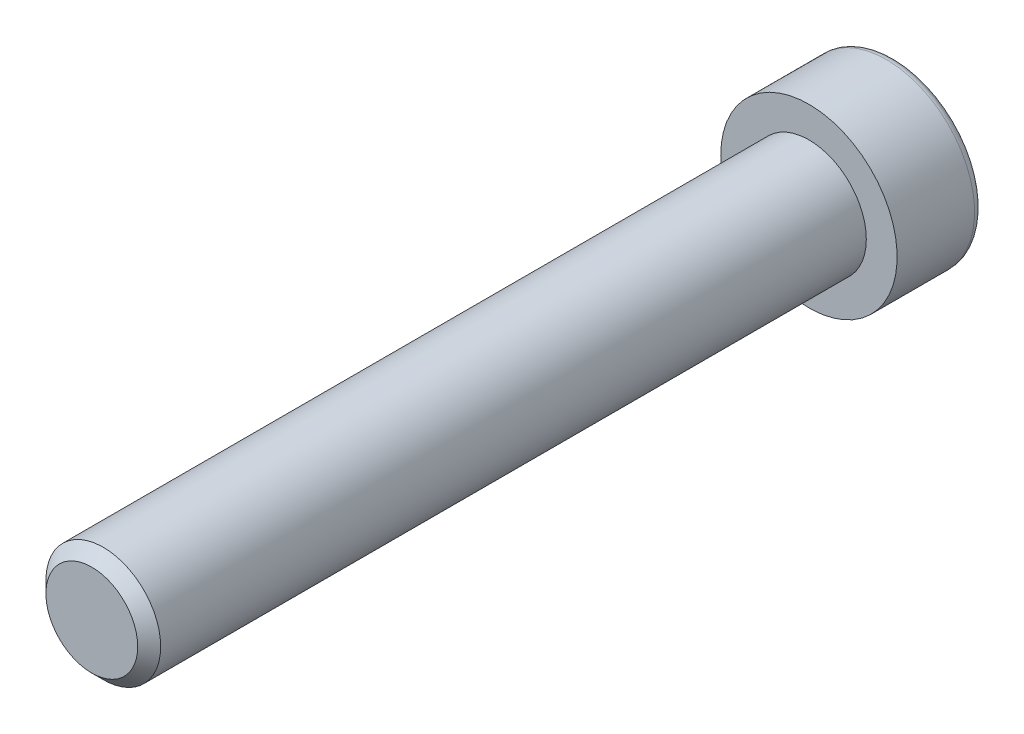
ISO-10303-21;
HEADER;
FILE_DESCRIPTION(('STEP AP214'),'2;1');
FILE_NAME('part.step','',(''),(''),'','','');
FILE_SCHEMA(('AUTOMOTIVE_DESIGN { 1 0 10303 214 1 1 1 1 }'));
ENDSEC;
DATA;
#1=APPLICATION_CONTEXT('core data for automotive mechanical design processes');
#2=APPLICATION_PROTOCOL_DEFINITION('international standard','automotive_design',2000,#1);
#3=PRODUCT_CONTEXT('',#1,'mechanical');
#4=PRODUCT('Part','Part','',(#3));
#5=PRODUCT_RELATED_PRODUCT_CATEGORY('part','',(#4));
#6=PRODUCT_DEFINITION_FORMATION('','',#4);
#7=PRODUCT_DEFINITION_CONTEXT('part definition',#1,'design');
#8=PRODUCT_DEFINITION('design','',#6,#7);
#9=PRODUCT_DEFINITION_SHAPE('','',#8);
#10=(LENGTH_UNIT() NAMED_UNIT(*) SI_UNIT(.MILLI.,.METRE.));
#11=(NAMED_UNIT(*) PLANE_ANGLE_UNIT() SI_UNIT($,.RADIAN.));
#12=(NAMED_UNIT(*) SI_UNIT($,.STERADIAN.) SOLID_ANGLE_UNIT());
#13=UNCERTAINTY_MEASURE_WITH_UNIT(LENGTH_MEASURE(1.E-05),#10,'distance_accuracy_value','');
#14=(GEOMETRIC_REPRESENTATION_CONTEXT(3) GLOBAL_UNCERTAINTY_ASSIGNED_CONTEXT((#13)) GLOBAL_UNIT_ASSIGNED_CONTEXT((#10,
#11,#12)) REPRESENTATION_CONTEXT('',''));
#15=CARTESIAN_POINT('',(0.,0.,0.));
#16=DIRECTION('',(0.,0.,1.));
#17=DIRECTION('',(1.,0.,0.));
#18=AXIS2_PLACEMENT_3D('',#15,#16,#17);
#19=CARTESIAN_POINT('',(0.,0.,-6.));
#20=DIRECTION('',(0.,0.,1.));
#21=DIRECTION('',(1.,0.,0.));
#22=AXIS2_PLACEMENT_3D('',#19,#20,#21);
#23=PLANE('',#22);
#24=CARTESIAN_POINT('',(0.,0.,-6.));
#25=DIRECTION('',(0.,0.,-1.));
#26=DIRECTION('',(-1.,0.,0.));
#27=AXIS2_PLACEMENT_3D('',#24,#25,#26);
#28=CIRCLE('',#27,5.55);
#29=CARTESIAN_POINT('',(-5.55,0.,-6.));
#30=VERTEX_POINT('',#29);
#31=EDGE_CURVE('E148',#30,#30,#28,.T.);
#32=ORIENTED_EDGE('',*,*,#31,.T.);
#33=EDGE_LOOP('',(#32));
#34=FACE_BOUND('',#33,.T.);
#35=DIRECTION('',(-0.86602540378444,0.499999999999998,0.));
#36=VECTOR('',#35,1.);
#37=CARTESIAN_POINT('',(0.,3.46410161513776,-6.));
#38=LINE('',#37,#36);
#39=CARTESIAN_POINT('',(3.,1.73205080756888,-6.));
#40=VERTEX_POINT('',#39);
#41=CARTESIAN_POINT('',(0.,3.46410161513776,-6.));
#42=VERTEX_POINT('',#41);
#43=EDGE_CURVE('E50',#40,#42,#38,.T.);
#44=ORIENTED_EDGE('',*,*,#43,.T.);
#45=DIRECTION('',(-0.866025403784438,-0.500000000000002,0.));
#46=VECTOR('',#45,1.);
#47=CARTESIAN_POINT('',(0.,3.46410161513776,-6.));
#48=LINE('',#47,#46);
#49=CARTESIAN_POINT('',(-3.,1.73205080756888,-6.));
#50=VERTEX_POINT('',#49);
#51=EDGE_CURVE('E121',#42,#50,#48,.T.);
#52=ORIENTED_EDGE('',*,*,#51,.T.);
#53=DIRECTION('',(0.,-1.,0.));
#54=VECTOR('',#53,1.);
#55=CARTESIAN_POINT('',(-3.,-1.73205080756888,-6.));
#56=LINE('',#55,#54);
#57=CARTESIAN_POINT('',(-3.,-1.73205080756888,-6.));
#58=VERTEX_POINT('',#57);
#59=EDGE_CURVE('E125',#50,#58,#56,.T.);
#60=ORIENTED_EDGE('',*,*,#59,.T.);
#61=DIRECTION('',(0.866025403784438,-0.500000000000002,0.));
#62=VECTOR('',#61,1.);
#63=CARTESIAN_POINT('',(0.,-3.46410161513776,-6.));
#64=LINE('',#63,#62);
#65=CARTESIAN_POINT('',(0.,-3.46410161513776,-6.));
#66=VERTEX_POINT('',#65);
#67=EDGE_CURVE('E128',#58,#66,#64,.T.);
#68=ORIENTED_EDGE('',*,*,#67,.T.);
#69=DIRECTION('',(0.86602540378444,0.499999999999998,0.));
#70=VECTOR('',#69,1.);
#71=CARTESIAN_POINT('',(0.,-3.46410161513776,-6.));
#72=LINE('',#71,#70);
#73=CARTESIAN_POINT('',(3.,-1.73205080756888,-6.));
#74=VERTEX_POINT('',#73);
#75=EDGE_CURVE('E111',#66,#74,#72,.T.);
#76=ORIENTED_EDGE('',*,*,#75,.T.);
#77=DIRECTION('',(0.,1.,0.));
#78=VECTOR('',#77,1.);
#79=CARTESIAN_POINT('',(3.,-1.73205080756888,-6.));
#80=LINE('',#79,#78);
#81=EDGE_CURVE('E131',#74,#40,#80,.T.);
#82=ORIENTED_EDGE('',*,*,#81,.T.);
#83=EDGE_LOOP('',(#44,#52,#60,#68,#76,#82));
#84=FACE_BOUND('',#83,.T.);
#85=ADVANCED_FACE('F35',(#34,#84),#23,.F.);
#86=CARTESIAN_POINT('',(0.,0.,-5.4));
#87=DIRECTION('',(0.,0.,-1.));
#88=DIRECTION('',(-1.,0.,0.));
#89=AXIS2_PLACEMENT_3D('',#86,#87,#88);
#90=TOROIDAL_SURFACE('',#89,5.55,0.6);
#91=ORIENTED_EDGE('',*,*,#31,.F.);
#92=EDGE_LOOP('',(#91));
#93=FACE_BOUND('',#92,.T.);
#94=CARTESIAN_POINT('',(0.,0.,-5.4));
#95=DIRECTION('',(0.,0.,-1.));
#96=DIRECTION('',(-1.,0.,0.));
#97=AXIS2_PLACEMENT_3D('',#94,#95,#96);
#98=CIRCLE('',#97,6.15);
#99=CARTESIAN_POINT('',(-6.15,0.,-5.4));
#100=VERTEX_POINT('',#99);
#101=EDGE_CURVE('E145',#100,#100,#98,.T.);
#102=ORIENTED_EDGE('',*,*,#101,.T.);
#103=EDGE_LOOP('',(#102));
#104=FACE_BOUND('',#103,.T.);
#105=ADVANCED_FACE('F165',(#93,#104),#90,.T.);
#106=CARTESIAN_POINT('',(0.,0.,0.));
#107=DIRECTION('',(0.,0.,-1.));
#108=DIRECTION('',(-1.,0.,0.));
#109=AXIS2_PLACEMENT_3D('',#106,#107,#108);
#110=CYLINDRICAL_SURFACE('',#109,6.15);
#111=ORIENTED_EDGE('',*,*,#101,.F.);
#112=EDGE_LOOP('',(#111));
#113=FACE_BOUND('',#112,.T.);
#114=CARTESIAN_POINT('',(0.,0.,0.));
#115=DIRECTION('',(0.,0.,-1.));
#116=DIRECTION('',(-1.,0.,0.));
#117=AXIS2_PLACEMENT_3D('',#114,#115,#116);
#118=CIRCLE('',#117,6.15);
#119=CARTESIAN_POINT('',(-6.15,0.,0.));
#120=VERTEX_POINT('',#119);
#121=EDGE_CURVE('E142',#120,#120,#118,.T.);
#122=ORIENTED_EDGE('',*,*,#121,.T.);
#123=EDGE_LOOP('',(#122));
#124=FACE_BOUND('',#123,.T.);
#125=ADVANCED_FACE('F170',(#113,#124),#110,.T.);
#126=CARTESIAN_POINT('',(0.,0.,0.));
#127=DIRECTION('',(0.,0.,-1.));
#128=DIRECTION('',(-1.,0.,0.));
#129=AXIS2_PLACEMENT_3D('',#126,#127,#128);
#130=PLANE('',#129);
#131=CARTESIAN_POINT('',(0.,0.,0.));
#132=DIRECTION('',(0.,0.,1.));
#133=DIRECTION('',(1.,0.,0.));
#134=AXIS2_PLACEMENT_3D('',#131,#132,#133);
#135=CIRCLE('',#134,4.);
#136=CARTESIAN_POINT('',(4.,0.,0.));
#137=VERTEX_POINT('',#136);
#138=EDGE_CURVE('E122',#137,#137,#135,.T.);
#139=ORIENTED_EDGE('',*,*,#138,.F.);
#140=EDGE_LOOP('',(#139));
#141=FACE_BOUND('',#140,.T.);
#142=ORIENTED_EDGE('',*,*,#121,.F.);
#143=EDGE_LOOP('',(#142));
#144=FACE_BOUND('',#143,.T.);
#145=ADVANCED_FACE('F177',(#141,#144),#130,.F.);
#146=CARTESIAN_POINT('',(0.,3.46410161513776,-3.));
#147=DIRECTION('',(-0.499999999999998,-0.86602540378444,0.));
#148=DIRECTION('',(0.86602540378444,-0.499999999999998,0.));
#149=AXIS2_PLACEMENT_3D('',#146,#147,#148);
#150=PLANE('',#149);
#151=ORIENTED_EDGE('',*,*,#43,.F.);
#152=DIRECTION('',(0.,0.,-1.));
#153=VECTOR('',#152,1.);
#154=CARTESIAN_POINT('',(3.,1.73205080756888,-3.));
#155=LINE('',#154,#153);
#156=CARTESIAN_POINT('',(3.,1.73205080756888,-3.));
#157=VERTEX_POINT('',#156);
#158=EDGE_CURVE('E116',#157,#40,#155,.T.);
#159=ORIENTED_EDGE('',*,*,#158,.F.);
#160=DIRECTION('',(-0.86602540378444,0.499999999999998,0.));
#161=VECTOR('',#160,1.);
#162=CARTESIAN_POINT('',(0.,3.46410161513776,-3.));
#163=LINE('',#162,#161);
#164=CARTESIAN_POINT('',(0.,3.46410161513776,-3.));
#165=VERTEX_POINT('',#164);
#166=EDGE_CURVE('E134',#157,#165,#163,.T.);
#167=ORIENTED_EDGE('',*,*,#166,.T.);
#168=DIRECTION('',(0.,0.,-1.));
#169=VECTOR('',#168,1.);
#170=CARTESIAN_POINT('',(0.,3.46410161513776,-3.));
#171=LINE('',#170,#169);
#172=EDGE_CURVE('E140',#165,#42,#171,.T.);
#173=ORIENTED_EDGE('',*,*,#172,.T.);
#174=EDGE_LOOP('',(#151,#159,#167,#173));
#175=FACE_BOUND('',#174,.T.);
#176=ADVANCED_FACE('F181',(#175),#150,.T.);
#177=CARTESIAN_POINT('',(0.,3.46410161513776,-3.));
#178=DIRECTION('',(0.500000000000002,-0.866025403784438,0.));
#179=DIRECTION('',(0.866025403784438,0.500000000000002,0.));
#180=AXIS2_PLACEMENT_3D('',#177,#178,#179);
#181=PLANE('',#180);
#182=ORIENTED_EDGE('',*,*,#51,.F.);
#183=ORIENTED_EDGE('',*,*,#172,.F.);
#184=DIRECTION('',(-0.866025403784438,-0.500000000000002,0.));
#185=VECTOR('',#184,1.);
#186=CARTESIAN_POINT('',(0.,3.46410161513776,-3.));
#187=LINE('',#186,#185);
#188=CARTESIAN_POINT('',(-3.,1.73205080756888,-3.));
#189=VERTEX_POINT('',#188);
#190=EDGE_CURVE('E89',#165,#189,#187,.T.);
#191=ORIENTED_EDGE('',*,*,#190,.T.);
#192=DIRECTION('',(0.,0.,-1.));
#193=VECTOR('',#192,1.);
#194=CARTESIAN_POINT('',(-3.,1.73205080756888,-3.));
#195=LINE('',#194,#193);
#196=EDGE_CURVE('E138',#189,#50,#195,.T.);
#197=ORIENTED_EDGE('',*,*,#196,.T.);
#198=EDGE_LOOP('',(#182,#183,#191,#197));
#199=FACE_BOUND('',#198,.T.);
#200=ADVANCED_FACE('F185',(#199),#181,.T.);
#201=CARTESIAN_POINT('',(-3.,-1.73205080756888,-3.));
#202=DIRECTION('',(1.,0.,0.));
#203=DIRECTION('',(0.,0.,-1.));
#204=AXIS2_PLACEMENT_3D('',#201,#202,#203);
#205=PLANE('',#204);
#206=ORIENTED_EDGE('',*,*,#59,.F.);
#207=ORIENTED_EDGE('',*,*,#196,.F.);
#208=DIRECTION('',(0.,-1.,0.));
#209=VECTOR('',#208,1.);
#210=CARTESIAN_POINT('',(-3.,-1.73205080756888,-3.));
#211=LINE('',#210,#209);
#212=CARTESIAN_POINT('',(-3.,-1.73205080756888,-3.));
#213=VERTEX_POINT('',#212);
#214=EDGE_CURVE('E107',#189,#213,#211,.T.);
#215=ORIENTED_EDGE('',*,*,#214,.T.);
#216=DIRECTION('',(0.,0.,-1.));
#217=VECTOR('',#216,1.);
#218=CARTESIAN_POINT('',(-3.,-1.73205080756888,-3.));
#219=LINE('',#218,#217);
#220=EDGE_CURVE('E104',#213,#58,#219,.T.);
#221=ORIENTED_EDGE('',*,*,#220,.T.);
#222=EDGE_LOOP('',(#206,#207,#215,#221));
#223=FACE_BOUND('',#222,.T.);
#224=ADVANCED_FACE('F188',(#223),#205,.T.);
#225=CARTESIAN_POINT('',(0.,-3.46410161513776,-3.));
#226=DIRECTION('',(0.500000000000002,0.866025403784438,0.));
#227=DIRECTION('',(-0.866025403784438,0.500000000000002,0.));
#228=AXIS2_PLACEMENT_3D('',#225,#226,#227);
#229=PLANE('',#228);
#230=ORIENTED_EDGE('',*,*,#67,.F.);
#231=ORIENTED_EDGE('',*,*,#220,.F.);
#232=DIRECTION('',(0.866025403784438,-0.500000000000002,0.));
#233=VECTOR('',#232,1.);
#234=CARTESIAN_POINT('',(0.,-3.46410161513776,-3.));
#235=LINE('',#234,#233);
#236=CARTESIAN_POINT('',(0.,-3.46410161513776,-3.));
#237=VERTEX_POINT('',#236);
#238=EDGE_CURVE('E99',#213,#237,#235,.T.);
#239=ORIENTED_EDGE('',*,*,#238,.T.);
#240=DIRECTION('',(0.,0.,-1.));
#241=VECTOR('',#240,1.);
#242=CARTESIAN_POINT('',(0.,-3.46410161513776,-3.));
#243=LINE('',#242,#241);
#244=EDGE_CURVE('E103',#237,#66,#243,.T.);
#245=ORIENTED_EDGE('',*,*,#244,.T.);
#246=EDGE_LOOP('',(#230,#231,#239,#245));
#247=FACE_BOUND('',#246,.T.);
#248=ADVANCED_FACE('F102',(#247),#229,.T.);
#249=CARTESIAN_POINT('',(0.,-3.46410161513776,-3.));
#250=DIRECTION('',(-0.499999999999998,0.86602540378444,0.));
#251=DIRECTION('',(-0.86602540378444,-0.499999999999998,0.));
#252=AXIS2_PLACEMENT_3D('',#249,#250,#251);
#253=PLANE('',#252);
#254=ORIENTED_EDGE('',*,*,#75,.F.);
#255=ORIENTED_EDGE('',*,*,#244,.F.);
#256=DIRECTION('',(0.86602540378444,0.499999999999998,0.));
#257=VECTOR('',#256,1.);
#258=CARTESIAN_POINT('',(0.,-3.46410161513776,-3.));
#259=LINE('',#258,#257);
#260=CARTESIAN_POINT('',(3.,-1.73205080756888,-3.));
#261=VERTEX_POINT('',#260);
#262=EDGE_CURVE('E106',#237,#261,#259,.T.);
#263=ORIENTED_EDGE('',*,*,#262,.T.);
#264=DIRECTION('',(0.,0.,-1.));
#265=VECTOR('',#264,1.);
#266=CARTESIAN_POINT('',(3.,-1.73205080756888,-3.));
#267=LINE('',#266,#265);
#268=EDGE_CURVE('E80',#261,#74,#267,.T.);
#269=ORIENTED_EDGE('',*,*,#268,.T.);
#270=EDGE_LOOP('',(#254,#255,#263,#269));
#271=FACE_BOUND('',#270,.T.);
#272=ADVANCED_FACE('F109',(#271),#253,.T.);
#273=CARTESIAN_POINT('',(3.,-1.73205080756888,-3.));
#274=DIRECTION('',(-1.,0.,0.));
#275=DIRECTION('',(0.,-1.,0.));
#276=AXIS2_PLACEMENT_3D('',#273,#274,#275);
#277=PLANE('',#276);
#278=ORIENTED_EDGE('',*,*,#81,.F.);
#279=ORIENTED_EDGE('',*,*,#268,.F.);
#280=DIRECTION('',(0.,1.,0.));
#281=VECTOR('',#280,1.);
#282=CARTESIAN_POINT('',(3.,-1.73205080756888,-3.));
#283=LINE('',#282,#281);
#284=EDGE_CURVE('E58',#261,#157,#283,.T.);
#285=ORIENTED_EDGE('',*,*,#284,.T.);
#286=ORIENTED_EDGE('',*,*,#158,.T.);
#287=EDGE_LOOP('',(#278,#279,#285,#286));
#288=FACE_BOUND('',#287,.T.);
#289=ADVANCED_FACE('F197',(#288),#277,.T.);
#290=CARTESIAN_POINT('',(3.,1.73205080756888,-3.));
#291=DIRECTION('',(0.,0.,1.));
#292=DIRECTION('',(1.,0.,0.));
#293=AXIS2_PLACEMENT_3D('',#290,#291,#292);
#294=PLANE('',#293);
#295=ORIENTED_EDGE('',*,*,#166,.F.);
#296=ORIENTED_EDGE('',*,*,#284,.F.);
#297=ORIENTED_EDGE('',*,*,#262,.F.);
#298=ORIENTED_EDGE('',*,*,#238,.F.);
#299=ORIENTED_EDGE('',*,*,#214,.F.);
#300=ORIENTED_EDGE('',*,*,#190,.F.);
#301=EDGE_LOOP('',(#295,#296,#297,#298,#299,#300));
#302=FACE_BOUND('',#301,.T.);
#303=ADVANCED_FACE('F114',(#302),#294,.F.);
#304=CARTESIAN_POINT('',(0.,0.,50.));
#305=DIRECTION('',(0.,0.,1.));
#306=DIRECTION('',(1.,0.,0.));
#307=AXIS2_PLACEMENT_3D('',#304,#305,#306);
#308=PLANE('',#307);
#309=CARTESIAN_POINT('',(0.,0.,50.));
#310=DIRECTION('',(0.,0.,1.));
#311=DIRECTION('',(1.,0.,0.));
#312=AXIS2_PLACEMENT_3D('',#309,#310,#311);
#313=CIRCLE('',#312,3.2);
#314=CARTESIAN_POINT('',(3.20000000000001,0.,50.));
#315=VERTEX_POINT('',#314);
#316=EDGE_CURVE('E43',#315,#315,#313,.T.);
#317=ORIENTED_EDGE('',*,*,#316,.T.);
#318=EDGE_LOOP('',(#317));
#319=FACE_BOUND('',#318,.T.);
#320=ADVANCED_FACE('F153',(#319),#308,.T.);
#321=CARTESIAN_POINT('',(0.,0.,0.));
#322=DIRECTION('',(0.,0.,1.));
#323=DIRECTION('',(1.,0.,0.));
#324=AXIS2_PLACEMENT_3D('',#321,#322,#323);
#325=CYLINDRICAL_SURFACE('',#324,4.);
#326=CARTESIAN_POINT('',(0.,0.,49.2));
#327=DIRECTION('',(0.,0.,1.));
#328=DIRECTION('',(1.,0.,0.));
#329=AXIS2_PLACEMENT_3D('',#326,#327,#328);
#330=CIRCLE('',#329,4.);
#331=CARTESIAN_POINT('',(4.00000000000001,0.,49.2));
#332=VERTEX_POINT('',#331);
#333=EDGE_CURVE('E11',#332,#332,#330,.F.);
#334=ORIENTED_EDGE('',*,*,#333,.T.);
#335=EDGE_LOOP('',(#334));
#336=FACE_BOUND('',#335,.T.);
#337=ORIENTED_EDGE('',*,*,#138,.T.);
#338=EDGE_LOOP('',(#337));
#339=FACE_BOUND('',#338,.T.);
#340=ADVANCED_FACE('F156',(#336,#339),#325,.T.);
#341=CARTESIAN_POINT('',(0.,0.,50.));
#342=DIRECTION('',(0.,0.,-1.));
#343=DIRECTION('',(-1.,0.,0.));
#344=AXIS2_PLACEMENT_3D('',#341,#342,#343);
#345=CONICAL_SURFACE('',#344,3.2,0.78539816339745);
#346=ORIENTED_EDGE('',*,*,#333,.F.);
#347=EDGE_LOOP('',(#346));
#348=FACE_BOUND('',#347,.T.);
#349=ORIENTED_EDGE('',*,*,#316,.F.);
#350=EDGE_LOOP('',(#349));
#351=FACE_BOUND('',#350,.T.);
#352=ADVANCED_FACE('F37',(#348,#351),#345,.T.);
#353=CLOSED_SHELL('',(#85,#105,#125,#145,#176,#200,#224,#248,#272,#289,#303,#320,#340,#352));
#354=MANIFOLD_SOLID_BREP('B2',#353);
#355=ADVANCED_BREP_SHAPE_REPRESENTATION('',(#18,#354),#14);
#356=SHAPE_DEFINITION_REPRESENTATION(#9,#355);
ENDSEC;
END-ISO-10303-21;
